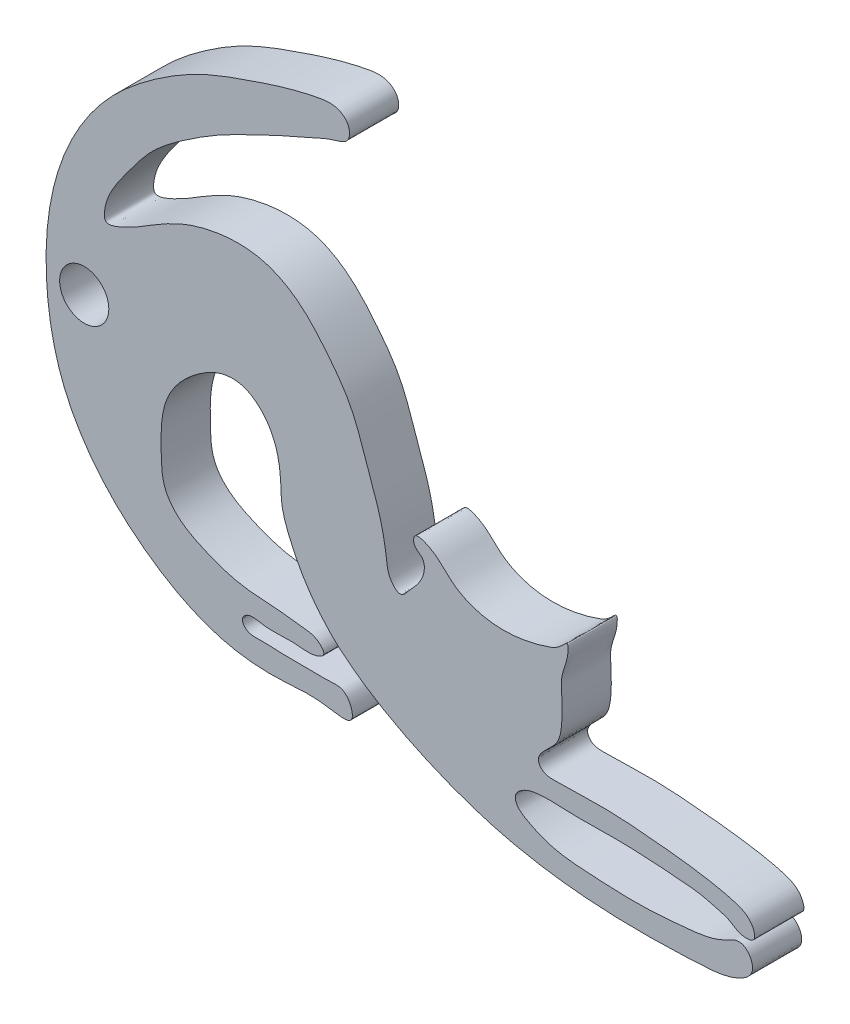
ISO-10303-21;
HEADER;
FILE_DESCRIPTION(('STEP AP214'),'2;1');
FILE_NAME('part.step','',(''),(''),'','','');
FILE_SCHEMA(('AUTOMOTIVE_DESIGN { 1 0 10303 214 1 1 1 1 }'));
ENDSEC;
DATA;
#1=APPLICATION_CONTEXT('core data for automotive mechanical design processes');
#2=APPLICATION_PROTOCOL_DEFINITION('international standard','automotive_design',2000,#1);
#3=PRODUCT_CONTEXT('',#1,'mechanical');
#4=PRODUCT('Part','Part','',(#3));
#5=PRODUCT_RELATED_PRODUCT_CATEGORY('part','',(#4));
#6=PRODUCT_DEFINITION_FORMATION('','',#4);
#7=PRODUCT_DEFINITION_CONTEXT('part definition',#1,'design');
#8=PRODUCT_DEFINITION('design','',#6,#7);
#9=PRODUCT_DEFINITION_SHAPE('','',#8);
#10=(LENGTH_UNIT() NAMED_UNIT(*) SI_UNIT(.MILLI.,.METRE.));
#11=(NAMED_UNIT(*) PLANE_ANGLE_UNIT() SI_UNIT($,.RADIAN.));
#12=(NAMED_UNIT(*) SI_UNIT($,.STERADIAN.) SOLID_ANGLE_UNIT());
#13=UNCERTAINTY_MEASURE_WITH_UNIT(LENGTH_MEASURE(1.E-05),#10,'distance_accuracy_value','');
#14=(GEOMETRIC_REPRESENTATION_CONTEXT(3) GLOBAL_UNCERTAINTY_ASSIGNED_CONTEXT((#13)) GLOBAL_UNIT_ASSIGNED_CONTEXT((#10,
#11,#12)) REPRESENTATION_CONTEXT('',''));
#15=CARTESIAN_POINT('',(0.,0.,0.));
#16=DIRECTION('',(0.,0.,1.));
#17=DIRECTION('',(1.,0.,0.));
#18=AXIS2_PLACEMENT_3D('',#15,#16,#17);
#19=CARTESIAN_POINT('',(26.4717625124031,24.5797292402926,3.7500085919994));
#20=DIRECTION('',(0.,0.,1.));
#21=DIRECTION('',(1.,0.,0.));
#22=AXIS2_PLACEMENT_3D('',#19,#20,#21);
#23=PLANE('',#22);
#24=CARTESIAN_POINT('',(41.0182972350144,32.0216643686747,3.7500085919994));
#25=CARTESIAN_POINT('',(40.7737614066542,31.7915770279576,3.7500085919994));
#26=CARTESIAN_POINT('',(39.8210271376714,31.4026596673257,3.7500085919994));
#27=CARTESIAN_POINT('',(37.7011364574368,30.9788487530631,3.7500085919994));
#28=CARTESIAN_POINT('',(35.4072878967229,31.8178230874308,3.7500085919994));
#29=CARTESIAN_POINT('',(34.6412694713521,32.9566871167299,3.7500085919994));
#30=CARTESIAN_POINT('',(33.4888611383299,33.2738806440687,3.7500085919994));
#31=CARTESIAN_POINT('',(33.4578027811983,32.5877040449544,3.7500085919994));
#32=CARTESIAN_POINT('',(34.0164936138714,32.4053275784175,3.7500085919994));
#33=CARTESIAN_POINT('',(34.0690119468501,31.7276178225917,3.7500085919994));
#34=CARTESIAN_POINT('',(33.7568965977168,31.0971144423106,3.7500085919994));
#35=CARTESIAN_POINT('',(33.3200264403711,30.6330973604322,3.7500085919994));
#36=CARTESIAN_POINT('',(32.7924680356492,30.0009272986247,3.7500085919994));
#37=CARTESIAN_POINT('',(32.179835348079,30.6674717672869,3.7500085919994));
#38=CARTESIAN_POINT('',(32.0960441998498,31.6323384496488,3.7500085919994));
#39=CARTESIAN_POINT('',(31.8077700441461,33.1579439435625,3.7500085919994));
#40=CARTESIAN_POINT('',(31.0709565674114,35.1045811843413,3.7500085919994));
#41=CARTESIAN_POINT('',(30.3995358256766,37.2379057267051,3.7500085919994));
#42=CARTESIAN_POINT('',(29.1031829434974,38.9496222590163,3.7500085919994));
#43=CARTESIAN_POINT('',(27.8521780778155,40.40864379818,3.7500085919994));
#44=CARTESIAN_POINT('',(25.8596951844265,41.607914437825,3.7500085919994));
#45=CARTESIAN_POINT('',(23.5894794862909,41.5520487170628,3.7500085919994));
#46=CARTESIAN_POINT('',(21.6774153000433,40.97219047194,3.7500085919994));
#47=CARTESIAN_POINT('',(20.1276437805058,40.1160627619354,3.7500085919994));
#48=CARTESIAN_POINT('',(19.1864031769432,39.4537642006604,3.7500085919994));
#49=CARTESIAN_POINT('',(17.7194507634808,38.8867446444327,3.7500085919994));
#50=CARTESIAN_POINT('',(17.7858932155296,39.7252849942215,3.7500085919994));
#51=CARTESIAN_POINT('',(18.0886047698445,40.6883522486271,3.7500085919994));
#52=CARTESIAN_POINT('',(18.9938328733404,41.8806755146758,3.7500085919994));
#53=CARTESIAN_POINT('',(20.2242242712908,43.5504287530339,3.7500085919994));
#54=CARTESIAN_POINT('',(21.8642368124445,44.7254134245189,3.7500085919994));
#55=CARTESIAN_POINT('',(23.5794174550638,45.8184359914426,3.7500085919994));
#56=CARTESIAN_POINT('',(25.4470859857014,46.7214397740723,3.7500085919994));
#57=CARTESIAN_POINT('',(27.0308905613961,47.4913641623933,3.7500085919994));
#58=CARTESIAN_POINT('',(28.4599575602603,48.0772861975175,3.7500085919994));
#59=CARTESIAN_POINT('',(29.2537008722685,48.4789245852598,3.7500085919994));
#60=CARTESIAN_POINT('',(30.2769236073425,48.6630676740177,3.7500085919994));
#61=CARTESIAN_POINT('',(30.2399452956151,49.5795700792429,3.7500085919994));
#62=CARTESIAN_POINT('',(29.5438993718449,50.1112789414385,3.7500085919994));
#63=CARTESIAN_POINT('',(27.7408561749425,49.8198876506455,3.7500085919994));
#64=CARTESIAN_POINT('',(25.4212382375596,49.0782881914466,3.7500085919994));
#65=CARTESIAN_POINT('',(22.5225802966719,48.0411643736609,3.7500085919994));
#66=CARTESIAN_POINT('',(20.1756299518322,46.5663652703608,3.7500085919994));
#67=CARTESIAN_POINT('',(17.9248313813074,44.7254710324519,3.7500085919994));
#68=CARTESIAN_POINT('',(16.2635510157376,42.4137795286458,3.7500085919994));
#69=CARTESIAN_POINT('',(14.9254964893584,39.017931980274,3.7500085919994));
#70=CARTESIAN_POINT('',(14.6143691092698,35.0224808409469,3.7500085919994));
#71=CARTESIAN_POINT('',(15.4594770559211,30.7188852157137,3.7500085919994));
#72=CARTESIAN_POINT('',(17.6393416541153,27.4030323910486,3.7500085919994));
#73=CARTESIAN_POINT('',(20.5338807839304,24.9614336287448,3.7500085919994));
#74=CARTESIAN_POINT('',(23.6589677739391,23.4759370717161,3.7500085919994));
#75=CARTESIAN_POINT('',(26.7573048530058,23.2882336002764,3.7500085919994));
#76=CARTESIAN_POINT('',(28.4981926869657,23.5715417051304,3.7500085919994));
#77=CARTESIAN_POINT('',(30.7211290488261,23.0257305592463,3.7500085919994));
#78=CARTESIAN_POINT('',(30.1146673442476,24.6357519116363,3.7500085919994));
#79=CARTESIAN_POINT('',(29.1465136845577,24.5281011961093,3.7500085919994));
#80=CARTESIAN_POINT('',(28.1971268887265,24.576166449424,3.7500085919994));
#81=CARTESIAN_POINT('',(26.9901880719841,24.5255196429624,3.7500085919994));
#82=CARTESIAN_POINT('',(25.9129606276812,24.633233607078,3.7500085919994));
#83=CARTESIAN_POINT('',(25.0245263004259,24.5553143263867,3.7500085919994));
#84=CARTESIAN_POINT('',(24.6973739281811,25.0731033142866,3.7500085919994));
#85=CARTESIAN_POINT('',(25.1135134488104,25.5256382408561,3.7500085919994));
#86=CARTESIAN_POINT('',(25.8645101433656,25.2955514259773,3.7500085919994));
#87=CARTESIAN_POINT('',(26.716102660369,25.3210394345755,3.7500085919994));
#88=CARTESIAN_POINT('',(27.62920877909,25.3559682244973,3.7500085919994));
#89=CARTESIAN_POINT('',(28.3124843158142,25.2181508344691,3.7500085919994));
#90=CARTESIAN_POINT('',(29.1320830784441,25.5598069213346,3.7500085919994));
#91=CARTESIAN_POINT('',(28.5220115234467,26.1869728801018,3.7500085919994));
#92=CARTESIAN_POINT('',(27.7087346703562,26.242917081825,3.7500085919994));
#93=CARTESIAN_POINT('',(26.3999400316336,26.443902276086,3.7500085919994));
#94=CARTESIAN_POINT('',(24.7053571652765,26.4539359418721,3.7500085919994));
#95=CARTESIAN_POINT('',(22.9844095492833,27.0635293635052,3.7500085919994));
#96=CARTESIAN_POINT('',(21.6085105680274,27.7338242961965,3.7500085919994));
#97=CARTESIAN_POINT('',(20.6893221449944,28.8947708517395,3.7500085919994));
#98=CARTESIAN_POINT('',(20.6558827654934,30.2869660053713,3.7500085919994));
#99=CARTESIAN_POINT('',(20.633667404285,31.5955605656942,3.7500085919994));
#100=CARTESIAN_POINT('',(20.8617913864775,32.8174408752794,3.7500085919994));
#101=CARTESIAN_POINT('',(21.5314895296363,33.9263417538504,3.7500085919994));
#102=CARTESIAN_POINT('',(22.5325576895093,34.7872910026168,3.7500085919994));
#103=CARTESIAN_POINT('',(23.6237937288352,35.4040122832398,3.7500085919994));
#104=CARTESIAN_POINT('',(24.7144242859406,35.4697400895019,3.7500085919994));
#105=CARTESIAN_POINT('',(25.6479921086374,34.9260355824767,3.7500085919994));
#106=CARTESIAN_POINT('',(26.5160534219472,33.8210536951888,3.7500085919994));
#107=CARTESIAN_POINT('',(26.7520389842418,32.4334395903341,3.7500085919994));
#108=CARTESIAN_POINT('',(26.7438370026551,31.0065072472222,3.7500085919994));
#109=CARTESIAN_POINT('',(27.2131178483194,29.6902209516475,3.7500085919994));
#110=CARTESIAN_POINT('',(28.0214376712267,28.1335814673099,3.7500085919994));
#111=CARTESIAN_POINT('',(29.3361087856641,26.491568972699,3.7500085919994));
#112=CARTESIAN_POINT('',(31.5521184703153,24.8139917658949,3.7500085919994));
#113=CARTESIAN_POINT('',(34.4033736294959,23.3627874993696,3.7500085919994));
#114=CARTESIAN_POINT('',(37.7924257770397,22.1647650830527,3.7500085919994));
#115=CARTESIAN_POINT('',(41.1732243067605,21.5704614765267,3.7500085919994));
#116=CARTESIAN_POINT('',(44.6695183196595,21.3762857470517,3.7500085919994));
#117=CARTESIAN_POINT('',(47.6302535718301,21.4727220015857,3.7500085919994));
#118=CARTESIAN_POINT('',(49.691630893893,21.6122920590393,3.7500085919994));
#119=CARTESIAN_POINT('',(50.8711214124377,22.3867245448469,3.7500085919994));
#120=CARTESIAN_POINT('',(50.6233892272687,23.2106095425805,3.7500085919994));
#121=CARTESIAN_POINT('',(50.0005386266859,23.6357676529853,3.7500085919994));
#122=CARTESIAN_POINT('',(49.1148444668121,23.0305924926868,3.7500085919994));
#123=CARTESIAN_POINT('',(47.9876459259313,22.8017482678954,3.7500085919994));
#124=CARTESIAN_POINT('',(46.6217957753676,22.6923187960335,3.7500085919994));
#125=CARTESIAN_POINT('',(45.3294530056261,22.5838604898991,3.7500085919994));
#126=CARTESIAN_POINT('',(43.8492670295853,22.6032365955433,3.7500085919994));
#127=CARTESIAN_POINT('',(42.346030296864,22.6864908064988,3.7500085919994));
#128=CARTESIAN_POINT('',(40.6810097573249,22.8057695731474,3.7500085919994));
#129=CARTESIAN_POINT('',(39.4967565610863,23.2752673654342,3.7500085919994));
#130=CARTESIAN_POINT('',(38.7549250505286,23.7696379266581,3.7500085919994));
#131=CARTESIAN_POINT('',(38.5794530236899,24.2925095518559,3.7500085919994));
#132=CARTESIAN_POINT('',(39.06341678397,24.7474868594543,3.7500085919994));
#133=CARTESIAN_POINT('',(40.0096229604652,24.9683155365528,3.7500085919994));
#134=CARTESIAN_POINT('',(41.7637640230037,24.817878087152,3.7500085919994));
#135=CARTESIAN_POINT('',(44.0985510380665,24.9401982869316,3.7500085919994));
#136=CARTESIAN_POINT('',(46.3865519953,24.7619193095762,3.7500085919994));
#137=CARTESIAN_POINT('',(48.0212269607418,24.6498965748144,3.7500085919994));
#138=CARTESIAN_POINT('',(48.9041707816824,24.3888648263043,3.7500085919994));
#139=CARTESIAN_POINT('',(49.576207002192,24.2197230797401,3.7500085919994));
#140=CARTESIAN_POINT('',(50.0175144008955,23.7994722967179,3.7500085919994));
#141=CARTESIAN_POINT('',(50.9794447560501,23.811653449015,3.7500085919994));
#142=CARTESIAN_POINT('',(50.6633340258817,24.8158713112059,3.7500085919994));
#143=CARTESIAN_POINT('',(49.7546478913811,25.1759598969311,3.7500085919994));
#144=CARTESIAN_POINT('',(48.1366407376049,25.5260089280936,3.7500085919994));
#145=CARTESIAN_POINT('',(45.9314623901945,25.7773994832398,3.7500085919994));
#146=CARTESIAN_POINT('',(43.2695417046341,26.0025915364663,3.7500085919994));
#147=CARTESIAN_POINT('',(41.3830920897793,25.8938800217631,3.7500085919994));
#148=CARTESIAN_POINT('',(40.077746288579,25.9008839109855,3.7500085919994));
#149=CARTESIAN_POINT('',(39.7194637377247,26.458157727924,3.7500085919994));
#150=CARTESIAN_POINT('',(40.2023275938906,27.0706588187018,3.7500085919994));
#151=CARTESIAN_POINT('',(40.8845310523167,27.5813352357346,3.7500085919994));
#152=CARTESIAN_POINT('',(41.0592247208592,28.6968165976584,3.7500085919994));
#153=CARTESIAN_POINT('',(41.0340024717334,29.6554674124158,3.7500085919994));
#154=CARTESIAN_POINT('',(40.9468167227791,30.8636298741799,3.7500085919994));
#155=CARTESIAN_POINT('',(41.36358675986,31.4676101809574,3.7500085919994));
#156=CARTESIAN_POINT('',(41.3377428256626,32.3595034207073,3.7500085919994));
#157=CARTESIAN_POINT('',(41.1351069710949,32.1315723593559,3.7500085919994));
#158=CARTESIAN_POINT('',(41.0182972350144,32.0216643686747,3.7500085919994));
#159=B_SPLINE_CURVE_WITH_KNOTS('',3,(#24,#25,#26,#27,#28,#29,#30,#31,#32,#33,#34,#35,#36,#37,
#38,#39,#40,#41,#42,#43,#44,#45,#46,#47,#48,#49,#50,#51,#52,#53,#54,#55,#56,#57,#58,#59,#60,#61,
#62,#63,#64,#65,#66,#67,#68,#69,#70,#71,#72,#73,#74,#75,#76,#77,#78,#79,#80,#81,#82,#83,#84,#85,
#86,#87,#88,#89,#90,#91,#92,#93,#94,#95,#96,#97,#98,#99,#100,#101,#102,#103,#104,#105,#106,#107,
#108,#109,#110,#111,#112,#113,#114,#115,#116,#117,#118,#119,#120,#121,#122,#123,#124,#125,#126,
#127,#128,#129,#130,#131,#132,#133,#134,#135,#136,#137,#138,#139,#140,#141,#142,#143,#144,#145,
#146,#147,#148,#149,#150,#151,#152,#153,#154,#155,#156,#157,#158),.UNSPECIFIED.,.T.,.F.,(4,1,1,
1,1,1,1,1,1,1,1,1,1,1,1,1,1,1,1,1,1,1,1,1,1,1,1,1,1,1,1,1,1,1,1,1,1,1,1,1,1,1,1,1,1,1,1,1,1,1,1,
1,1,1,1,1,1,1,1,1,1,1,1,1,1,1,1,1,1,1,1,1,1,1,1,1,1,1,1,1,1,1,1,1,1,1,1,1,1,1,1,1,1,1,1,1,1,1,1,
1,1,1,1,1,1,1,1,1,1,1,1,1,1,1,1,1,1,1,1,1,1,1,1,1,1,1,1,1,1,1,1,1,4),(0.,0.00370956086831377,
0.0182044030149116,0.0286372076267936,0.0372314960034836,0.0398485193164946,0.0417412567508784,
0.0446154035380782,0.0471213630099165,0.0505719273904096,0.0546983299230098,0.057282943028178,
0.0604798999202186,0.0645289738786274,0.0722159390900335,0.0829282161824114,0.0954193322694708,
0.1048025140236,0.11435375283318,0.123716700075731,0.138094764149384,0.145992666621013,
0.153490102376132,0.163013141118701,0.166975410946242,0.169447504544199,0.172617985146904,
0.182919616445553,0.19046126665499,0.203401558031312,0.212161371181066,0.220547502799107,
0.233929539813537,0.238295441960948,0.243089318944282,0.247711270415172,0.250974841622056,
0.25396603335066,0.259627520397147,0.276266170754819,0.290920893887504,0.304574798682978,
0.31701316212443,0.333648792322805,0.345890952473361,0.370533766198049,0.391664320663789,
0.409422738553032,0.427955198393721,0.446940379959313,0.459900083640175,0.471368224067675,
0.477472118886018,0.483037900109915,0.486225403328102,0.490949776906089,0.497356983333266,
0.503761293505917,0.50743702736704,0.509384638119298,0.510949375560668,0.515074879640529,
0.51957737679452,0.523932366830279,0.528142190531514,0.530681564271618,0.533584890962124,
0.537035455342618,0.543319665556273,0.552795591938397,0.561931849454227,0.569998710140414,
0.5750795318488,0.582860501545712,0.589684863416373,0.594581941647859,0.600956049766028,
0.608358109490641,0.613876339955374,0.619249455681928,0.623536166169066,0.629317359625586,
0.639458243789999,0.643502512471389,0.650347208973165,0.65969776912512,0.669401136921307,
0.681076878833999,0.700427066606361,0.71640327960564,0.733970805362887,0.750840732437325,
0.768121014857146,0.777288357958716,0.782014631391379,0.785783368632683,0.787799100947602,
0.792277362858422,0.799238954569846,0.805336772145441,0.81231768428668,0.818416902007382,
0.827137762757811,0.834592304927515,0.842868059286389,0.845749528752431,0.847404679624206,
0.850193233849381,0.854003677309687,0.861842659374054,0.875778627488485,0.888567109690917,
0.8957290373361,0.899767418833437,0.902239732386982,0.905683075827015,0.909050183843931,
0.912153485627281,0.916985584267096,0.923253005216946,0.936577503516129,0.94981632303826,
0.962122372416787,0.965728118165113,0.967421033991849,0.97066705191228,0.975393325344942,
0.980181614389195,0.986133434104733,0.990052925136917,0.997201538068656,0.998228019064085,1.),.UNSPECIFIED.);
#160=CARTESIAN_POINT('',(41.0182972350144,32.0216643686747,3.7500085919994));
#161=VERTEX_POINT('',#160);
#162=EDGE_CURVE('E11',#161,#161,#159,.T.);
#163=ORIENTED_EDGE('',*,*,#162,.T.);
#164=EDGE_LOOP('',(#163));
#165=FACE_BOUND('',#164,.T.);
#166=CARTESIAN_POINT('',(16.7443658882274,35.326755155431,3.7500085919994));
#167=DIRECTION('',(0.,0.,1.));
#168=DIRECTION('',(1.,0.,0.));
#169=AXIS2_PLACEMENT_3D('',#166,#167,#168);
#170=CIRCLE('',#169,1.25);
#171=CARTESIAN_POINT('',(17.9943658882274,35.326755155431,3.7500085919994));
#172=VERTEX_POINT('',#171);
#173=EDGE_CURVE('E53',#172,#172,#170,.T.);
#174=ORIENTED_EDGE('',*,*,#173,.F.);
#175=EDGE_LOOP('',(#174));
#176=FACE_BOUND('',#175,.T.);
#177=ADVANCED_FACE('F38',(#165,#176),#23,.T.);
#178=CARTESIAN_POINT('',(26.4717625124031,24.5797292402926,1.2500085919994));
#179=DIRECTION('',(0.,0.,1.));
#180=DIRECTION('',(1.,0.,0.));
#181=AXIS2_PLACEMENT_3D('',#178,#179,#180);
#182=PLANE('',#181);
#183=CARTESIAN_POINT('',(41.0182972350144,32.0216643686747,1.2500085919994));
#184=CARTESIAN_POINT('',(40.7737614066542,31.7915770279576,1.2500085919994));
#185=CARTESIAN_POINT('',(39.8210271376714,31.4026596673257,1.2500085919994));
#186=CARTESIAN_POINT('',(37.7011364574368,30.9788487530631,1.2500085919994));
#187=CARTESIAN_POINT('',(35.4072878967229,31.8178230874308,1.2500085919994));
#188=CARTESIAN_POINT('',(34.6412694713521,32.9566871167299,1.2500085919994));
#189=CARTESIAN_POINT('',(33.4888611383299,33.2738806440687,1.2500085919994));
#190=CARTESIAN_POINT('',(33.4578027811983,32.5877040449544,1.2500085919994));
#191=CARTESIAN_POINT('',(34.0164936138714,32.4053275784175,1.2500085919994));
#192=CARTESIAN_POINT('',(34.0690119468501,31.7276178225917,1.2500085919994));
#193=CARTESIAN_POINT('',(33.7568965977168,31.0971144423106,1.2500085919994));
#194=CARTESIAN_POINT('',(33.3200264403711,30.6330973604322,1.2500085919994));
#195=CARTESIAN_POINT('',(32.7924680356492,30.0009272986247,1.2500085919994));
#196=CARTESIAN_POINT('',(32.179835348079,30.6674717672869,1.2500085919994));
#197=CARTESIAN_POINT('',(32.0960441998498,31.6323384496488,1.2500085919994));
#198=CARTESIAN_POINT('',(31.8077700441461,33.1579439435625,1.2500085919994));
#199=CARTESIAN_POINT('',(31.0709565674114,35.1045811843413,1.2500085919994));
#200=CARTESIAN_POINT('',(30.3995358256766,37.2379057267051,1.2500085919994));
#201=CARTESIAN_POINT('',(29.1031829434974,38.9496222590163,1.2500085919994));
#202=CARTESIAN_POINT('',(27.8521780778155,40.40864379818,1.2500085919994));
#203=CARTESIAN_POINT('',(25.8596951844265,41.607914437825,1.2500085919994));
#204=CARTESIAN_POINT('',(23.5894794862909,41.5520487170628,1.2500085919994));
#205=CARTESIAN_POINT('',(21.6774153000433,40.97219047194,1.2500085919994));
#206=CARTESIAN_POINT('',(20.1276437805058,40.1160627619354,1.2500085919994));
#207=CARTESIAN_POINT('',(19.1864031769432,39.4537642006604,1.2500085919994));
#208=CARTESIAN_POINT('',(17.7194507634808,38.8867446444327,1.2500085919994));
#209=CARTESIAN_POINT('',(17.7858932155296,39.7252849942215,1.2500085919994));
#210=CARTESIAN_POINT('',(18.0886047698445,40.6883522486271,1.2500085919994));
#211=CARTESIAN_POINT('',(18.9938328733404,41.8806755146758,1.2500085919994));
#212=CARTESIAN_POINT('',(20.2242242712908,43.5504287530339,1.2500085919994));
#213=CARTESIAN_POINT('',(21.8642368124445,44.7254134245189,1.2500085919994));
#214=CARTESIAN_POINT('',(23.5794174550638,45.8184359914426,1.2500085919994));
#215=CARTESIAN_POINT('',(25.4470859857014,46.7214397740723,1.2500085919994));
#216=CARTESIAN_POINT('',(27.0308905613961,47.4913641623933,1.2500085919994));
#217=CARTESIAN_POINT('',(28.4599575602603,48.0772861975175,1.2500085919994));
#218=CARTESIAN_POINT('',(29.2537008722685,48.4789245852598,1.2500085919994));
#219=CARTESIAN_POINT('',(30.2769236073425,48.6630676740177,1.2500085919994));
#220=CARTESIAN_POINT('',(30.2399452956151,49.5795700792429,1.2500085919994));
#221=CARTESIAN_POINT('',(29.5438993718449,50.1112789414385,1.2500085919994));
#222=CARTESIAN_POINT('',(27.7408561749425,49.8198876506455,1.2500085919994));
#223=CARTESIAN_POINT('',(25.4212382375596,49.0782881914466,1.2500085919994));
#224=CARTESIAN_POINT('',(22.5225802966719,48.0411643736609,1.2500085919994));
#225=CARTESIAN_POINT('',(20.1756299518322,46.5663652703608,1.2500085919994));
#226=CARTESIAN_POINT('',(17.9248313813074,44.7254710324519,1.2500085919994));
#227=CARTESIAN_POINT('',(16.2635510157376,42.4137795286458,1.2500085919994));
#228=CARTESIAN_POINT('',(14.9254964893584,39.017931980274,1.2500085919994));
#229=CARTESIAN_POINT('',(14.6143691092698,35.0224808409469,1.2500085919994));
#230=CARTESIAN_POINT('',(15.4594770559211,30.7188852157137,1.2500085919994));
#231=CARTESIAN_POINT('',(17.6393416541153,27.4030323910486,1.2500085919994));
#232=CARTESIAN_POINT('',(20.5338807839304,24.9614336287448,1.2500085919994));
#233=CARTESIAN_POINT('',(23.6589677739391,23.4759370717161,1.2500085919994));
#234=CARTESIAN_POINT('',(26.7573048530058,23.2882336002764,1.2500085919994));
#235=CARTESIAN_POINT('',(28.4981926869657,23.5715417051304,1.2500085919994));
#236=CARTESIAN_POINT('',(30.7211290488261,23.0257305592463,1.2500085919994));
#237=CARTESIAN_POINT('',(30.1146673442476,24.6357519116363,1.2500085919994));
#238=CARTESIAN_POINT('',(29.1465136845577,24.5281011961093,1.2500085919994));
#239=CARTESIAN_POINT('',(28.1971268887265,24.576166449424,1.2500085919994));
#240=CARTESIAN_POINT('',(26.9901880719841,24.5255196429624,1.2500085919994));
#241=CARTESIAN_POINT('',(25.9129606276812,24.633233607078,1.2500085919994));
#242=CARTESIAN_POINT('',(25.0245263004259,24.5553143263867,1.2500085919994));
#243=CARTESIAN_POINT('',(24.6973739281811,25.0731033142866,1.2500085919994));
#244=CARTESIAN_POINT('',(25.1135134488104,25.5256382408561,1.2500085919994));
#245=CARTESIAN_POINT('',(25.8645101433656,25.2955514259773,1.2500085919994));
#246=CARTESIAN_POINT('',(26.716102660369,25.3210394345755,1.2500085919994));
#247=CARTESIAN_POINT('',(27.62920877909,25.3559682244973,1.2500085919994));
#248=CARTESIAN_POINT('',(28.3124843158142,25.2181508344691,1.2500085919994));
#249=CARTESIAN_POINT('',(29.1320830784441,25.5598069213346,1.2500085919994));
#250=CARTESIAN_POINT('',(28.5220115234467,26.1869728801018,1.2500085919994));
#251=CARTESIAN_POINT('',(27.7087346703562,26.242917081825,1.2500085919994));
#252=CARTESIAN_POINT('',(26.3999400316336,26.443902276086,1.2500085919994));
#253=CARTESIAN_POINT('',(24.7053571652765,26.4539359418721,1.2500085919994));
#254=CARTESIAN_POINT('',(22.9844095492833,27.0635293635052,1.2500085919994));
#255=CARTESIAN_POINT('',(21.6085105680274,27.7338242961965,1.2500085919994));
#256=CARTESIAN_POINT('',(20.6893221449944,28.8947708517395,1.2500085919994));
#257=CARTESIAN_POINT('',(20.6558827654934,30.2869660053713,1.2500085919994));
#258=CARTESIAN_POINT('',(20.633667404285,31.5955605656942,1.2500085919994));
#259=CARTESIAN_POINT('',(20.8617913864775,32.8174408752794,1.2500085919994));
#260=CARTESIAN_POINT('',(21.5314895296363,33.9263417538504,1.2500085919994));
#261=CARTESIAN_POINT('',(22.5325576895093,34.7872910026168,1.2500085919994));
#262=CARTESIAN_POINT('',(23.6237937288352,35.4040122832398,1.2500085919994));
#263=CARTESIAN_POINT('',(24.7144242859406,35.4697400895019,1.2500085919994));
#264=CARTESIAN_POINT('',(25.6479921086374,34.9260355824767,1.2500085919994));
#265=CARTESIAN_POINT('',(26.5160534219472,33.8210536951888,1.2500085919994));
#266=CARTESIAN_POINT('',(26.7520389842418,32.4334395903341,1.2500085919994));
#267=CARTESIAN_POINT('',(26.7438370026551,31.0065072472222,1.2500085919994));
#268=CARTESIAN_POINT('',(27.2131178483194,29.6902209516475,1.2500085919994));
#269=CARTESIAN_POINT('',(28.0214376712267,28.1335814673099,1.2500085919994));
#270=CARTESIAN_POINT('',(29.3361087856641,26.491568972699,1.2500085919994));
#271=CARTESIAN_POINT('',(31.5521184703153,24.8139917658949,1.2500085919994));
#272=CARTESIAN_POINT('',(34.4033736294959,23.3627874993696,1.2500085919994));
#273=CARTESIAN_POINT('',(37.7924257770397,22.1647650830527,1.2500085919994));
#274=CARTESIAN_POINT('',(41.1732243067605,21.5704614765267,1.2500085919994));
#275=CARTESIAN_POINT('',(44.6695183196595,21.3762857470517,1.2500085919994));
#276=CARTESIAN_POINT('',(47.6302535718301,21.4727220015857,1.2500085919994));
#277=CARTESIAN_POINT('',(49.691630893893,21.6122920590393,1.2500085919994));
#278=CARTESIAN_POINT('',(50.8711214124377,22.3867245448469,1.2500085919994));
#279=CARTESIAN_POINT('',(50.6233892272687,23.2106095425805,1.2500085919994));
#280=CARTESIAN_POINT('',(50.0005386266859,23.6357676529853,1.2500085919994));
#281=CARTESIAN_POINT('',(49.1148444668121,23.0305924926868,1.2500085919994));
#282=CARTESIAN_POINT('',(47.9876459259313,22.8017482678954,1.2500085919994));
#283=CARTESIAN_POINT('',(46.6217957753676,22.6923187960335,1.2500085919994));
#284=CARTESIAN_POINT('',(45.3294530056261,22.5838604898991,1.2500085919994));
#285=CARTESIAN_POINT('',(43.8492670295853,22.6032365955433,1.2500085919994));
#286=CARTESIAN_POINT('',(42.346030296864,22.6864908064988,1.2500085919994));
#287=CARTESIAN_POINT('',(40.6810097573249,22.8057695731474,1.2500085919994));
#288=CARTESIAN_POINT('',(39.4967565610863,23.2752673654342,1.2500085919994));
#289=CARTESIAN_POINT('',(38.7549250505286,23.7696379266581,1.2500085919994));
#290=CARTESIAN_POINT('',(38.5794530236899,24.2925095518559,1.2500085919994));
#291=CARTESIAN_POINT('',(39.06341678397,24.7474868594543,1.2500085919994));
#292=CARTESIAN_POINT('',(40.0096229604652,24.9683155365528,1.2500085919994));
#293=CARTESIAN_POINT('',(41.7637640230037,24.817878087152,1.2500085919994));
#294=CARTESIAN_POINT('',(44.0985510380665,24.9401982869316,1.2500085919994));
#295=CARTESIAN_POINT('',(46.3865519953,24.7619193095762,1.2500085919994));
#296=CARTESIAN_POINT('',(48.0212269607418,24.6498965748144,1.2500085919994));
#297=CARTESIAN_POINT('',(48.9041707816824,24.3888648263043,1.2500085919994));
#298=CARTESIAN_POINT('',(49.576207002192,24.2197230797401,1.2500085919994));
#299=CARTESIAN_POINT('',(50.0175144008955,23.7994722967179,1.2500085919994));
#300=CARTESIAN_POINT('',(50.9794447560501,23.811653449015,1.2500085919994));
#301=CARTESIAN_POINT('',(50.6633340258817,24.8158713112059,1.2500085919994));
#302=CARTESIAN_POINT('',(49.7546478913811,25.1759598969311,1.2500085919994));
#303=CARTESIAN_POINT('',(48.1366407376049,25.5260089280936,1.2500085919994));
#304=CARTESIAN_POINT('',(45.9314623901945,25.7773994832398,1.2500085919994));
#305=CARTESIAN_POINT('',(43.2695417046341,26.0025915364663,1.2500085919994));
#306=CARTESIAN_POINT('',(41.3830920897793,25.8938800217631,1.2500085919994));
#307=CARTESIAN_POINT('',(40.077746288579,25.9008839109855,1.2500085919994));
#308=CARTESIAN_POINT('',(39.7194637377247,26.458157727924,1.2500085919994));
#309=CARTESIAN_POINT('',(40.2023275938906,27.0706588187018,1.2500085919994));
#310=CARTESIAN_POINT('',(40.8845310523167,27.5813352357346,1.2500085919994));
#311=CARTESIAN_POINT('',(41.0592247208592,28.6968165976584,1.2500085919994));
#312=CARTESIAN_POINT('',(41.0340024717334,29.6554674124158,1.2500085919994));
#313=CARTESIAN_POINT('',(40.9468167227791,30.8636298741799,1.2500085919994));
#314=CARTESIAN_POINT('',(41.36358675986,31.4676101809574,1.2500085919994));
#315=CARTESIAN_POINT('',(41.3377428256626,32.3595034207073,1.2500085919994));
#316=CARTESIAN_POINT('',(41.1351069710949,32.1315723593559,1.2500085919994));
#317=CARTESIAN_POINT('',(41.0182972350144,32.0216643686747,1.2500085919994));
#318=B_SPLINE_CURVE_WITH_KNOTS('',3,(#183,#184,#185,#186,#187,#188,#189,#190,#191,#192,#193,
#194,#195,#196,#197,#198,#199,#200,#201,#202,#203,#204,#205,#206,#207,#208,#209,#210,#211,#212,
#213,#214,#215,#216,#217,#218,#219,#220,#221,#222,#223,#224,#225,#226,#227,#228,#229,#230,#231,
#232,#233,#234,#235,#236,#237,#238,#239,#240,#241,#242,#243,#244,#245,#246,#247,#248,#249,#250,
#251,#252,#253,#254,#255,#256,#257,#258,#259,#260,#261,#262,#263,#264,#265,#266,#267,#268,#269,
#270,#271,#272,#273,#274,#275,#276,#277,#278,#279,#280,#281,#282,#283,#284,#285,#286,#287,#288,
#289,#290,#291,#292,#293,#294,#295,#296,#297,#298,#299,#300,#301,#302,#303,#304,#305,#306,#307,
#308,#309,#310,#311,#312,#313,#314,#315,#316,#317),.UNSPECIFIED.,.T.,.F.,(4,1,1,1,1,1,1,1,1,1,1,
1,1,1,1,1,1,1,1,1,1,1,1,1,1,1,1,1,1,1,1,1,1,1,1,1,1,1,1,1,1,1,1,1,1,1,1,1,1,1,1,1,1,1,1,1,1,1,1,
1,1,1,1,1,1,1,1,1,1,1,1,1,1,1,1,1,1,1,1,1,1,1,1,1,1,1,1,1,1,1,1,1,1,1,1,1,1,1,1,1,1,1,1,1,1,1,1,
1,1,1,1,1,1,1,1,1,1,1,1,1,1,1,1,1,1,1,1,1,1,1,1,1,4),(0.,0.00370956086831377,0.0182044030149116,
0.0286372076267936,0.0372314960034836,0.0398485193164946,0.0417412567508784,0.0446154035380782,
0.0471213630099165,0.0505719273904096,0.0546983299230098,0.057282943028178,0.0604798999202186,
0.0645289738786274,0.0722159390900335,0.0829282161824114,0.0954193322694708,0.1048025140236,
0.11435375283318,0.123716700075731,0.138094764149384,0.145992666621013,0.153490102376132,
0.163013141118701,0.166975410946242,0.169447504544199,0.172617985146904,0.182919616445553,
0.19046126665499,0.203401558031312,0.212161371181066,0.220547502799107,0.233929539813537,
0.238295441960948,0.243089318944282,0.247711270415172,0.250974841622056,0.25396603335066,
0.259627520397147,0.276266170754819,0.290920893887504,0.304574798682978,0.31701316212443,
0.333648792322805,0.345890952473361,0.370533766198049,0.391664320663789,0.409422738553032,
0.427955198393721,0.446940379959313,0.459900083640175,0.471368224067675,0.477472118886018,
0.483037900109915,0.486225403328102,0.490949776906089,0.497356983333266,0.503761293505917,
0.50743702736704,0.509384638119298,0.510949375560668,0.515074879640529,0.51957737679452,
0.523932366830279,0.528142190531514,0.530681564271618,0.533584890962124,0.537035455342618,
0.543319665556273,0.552795591938397,0.561931849454227,0.569998710140414,0.5750795318488,
0.582860501545712,0.589684863416373,0.594581941647859,0.600956049766028,0.608358109490641,
0.613876339955374,0.619249455681928,0.623536166169066,0.629317359625586,0.639458243789999,
0.643502512471389,0.650347208973165,0.65969776912512,0.669401136921307,0.681076878833999,
0.700427066606361,0.71640327960564,0.733970805362887,0.750840732437325,0.768121014857146,
0.777288357958716,0.782014631391379,0.785783368632683,0.787799100947602,0.792277362858422,
0.799238954569846,0.805336772145441,0.81231768428668,0.818416902007382,0.827137762757811,
0.834592304927515,0.842868059286389,0.845749528752431,0.847404679624206,0.850193233849381,
0.854003677309687,0.861842659374054,0.875778627488485,0.888567109690917,0.8957290373361,
0.899767418833437,0.902239732386982,0.905683075827015,0.909050183843931,0.912153485627281,
0.916985584267096,0.923253005216946,0.936577503516129,0.94981632303826,0.962122372416787,
0.965728118165113,0.967421033991849,0.97066705191228,0.975393325344942,0.980181614389195,
0.986133434104733,0.990052925136917,0.997201538068656,0.998228019064085,1.),.UNSPECIFIED.);
#319=CARTESIAN_POINT('',(41.0182972350144,32.0216643686747,1.2500085919994));
#320=VERTEX_POINT('',#319);
#321=EDGE_CURVE('E43',#320,#320,#318,.T.);
#322=ORIENTED_EDGE('',*,*,#321,.F.);
#323=EDGE_LOOP('',(#322));
#324=FACE_BOUND('',#323,.T.);
#325=CARTESIAN_POINT('',(16.7443658882274,35.326755155431,1.2500085919994));
#326=DIRECTION('',(0.,0.,1.));
#327=DIRECTION('',(1.,0.,0.));
#328=AXIS2_PLACEMENT_3D('',#325,#326,#327);
#329=CIRCLE('',#328,1.25);
#330=CARTESIAN_POINT('',(17.9943658882274,35.326755155431,1.2500085919994));
#331=VERTEX_POINT('',#330);
#332=EDGE_CURVE('E58',#331,#331,#329,.T.);
#333=ORIENTED_EDGE('',*,*,#332,.T.);
#334=EDGE_LOOP('',(#333));
#335=FACE_BOUND('',#334,.T.);
#336=ADVANCED_FACE('F72',(#324,#335),#182,.F.);
#337=DIRECTION('',(0.,0.,-1.));
#338=VECTOR('',#337,1.);
#339=SURFACE_OF_LINEAR_EXTRUSION('',#159,#338);
#340=ORIENTED_EDGE('',*,*,#162,.F.);
#341=EDGE_LOOP('',(#340));
#342=FACE_BOUND('',#341,.T.);
#343=ORIENTED_EDGE('',*,*,#321,.T.);
#344=EDGE_LOOP('',(#343));
#345=FACE_BOUND('',#344,.T.);
#346=ADVANCED_FACE('F40',(#342,#345),#339,.F.);
#347=CARTESIAN_POINT('',(16.7443658882274,35.326755155431,3.7500085919994));
#348=DIRECTION('',(0.,0.,-1.));
#349=DIRECTION('',(-1.,0.,0.));
#350=AXIS2_PLACEMENT_3D('',#347,#348,#349);
#351=CYLINDRICAL_SURFACE('',#350,1.25);
#352=ORIENTED_EDGE('',*,*,#173,.T.);
#353=EDGE_LOOP('',(#352));
#354=FACE_BOUND('',#353,.T.);
#355=ORIENTED_EDGE('',*,*,#332,.F.);
#356=EDGE_LOOP('',(#355));
#357=FACE_BOUND('',#356,.T.);
#358=ADVANCED_FACE('F68',(#354,#357),#351,.F.);
#359=CLOSED_SHELL('',(#177,#336,#346,#358));
#360=MANIFOLD_SOLID_BREP('B2',#359);
#361=ADVANCED_BREP_SHAPE_REPRESENTATION('',(#18,#360),#14);
#362=SHAPE_DEFINITION_REPRESENTATION(#9,#361);
ENDSEC;
END-ISO-10303-21;
